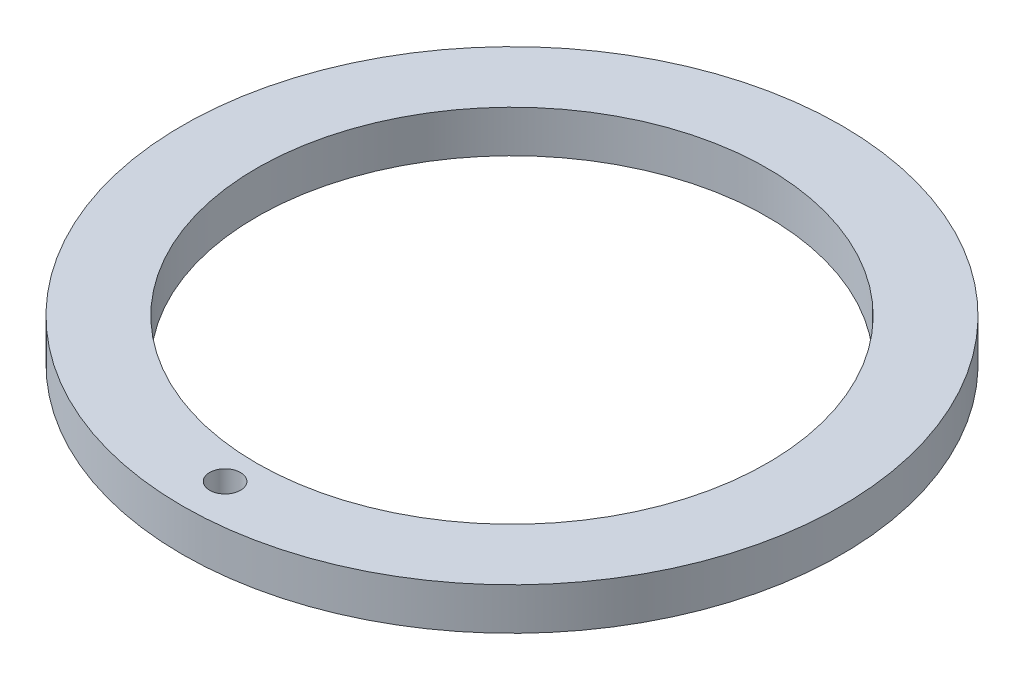
ISO-10303-21;
HEADER;
FILE_DESCRIPTION(('STEP AP214'),'2;1');
FILE_NAME('part.step','',(''),(''),'','','');
FILE_SCHEMA(('AUTOMOTIVE_DESIGN { 1 0 10303 214 1 1 1 1 }'));
ENDSEC;
DATA;
#1=APPLICATION_CONTEXT('core data for automotive mechanical design processes');
#2=APPLICATION_PROTOCOL_DEFINITION('international standard','automotive_design',2000,#1);
#3=PRODUCT_CONTEXT('',#1,'mechanical');
#4=PRODUCT('Part','Part','',(#3));
#5=PRODUCT_RELATED_PRODUCT_CATEGORY('part','',(#4));
#6=PRODUCT_DEFINITION_FORMATION('','',#4);
#7=PRODUCT_DEFINITION_CONTEXT('part definition',#1,'design');
#8=PRODUCT_DEFINITION('design','',#6,#7);
#9=PRODUCT_DEFINITION_SHAPE('','',#8);
#10=(LENGTH_UNIT() NAMED_UNIT(*) SI_UNIT(.MILLI.,.METRE.));
#11=(NAMED_UNIT(*) PLANE_ANGLE_UNIT() SI_UNIT($,.RADIAN.));
#12=(NAMED_UNIT(*) SI_UNIT($,.STERADIAN.) SOLID_ANGLE_UNIT());
#13=UNCERTAINTY_MEASURE_WITH_UNIT(LENGTH_MEASURE(1.E-05),#10,'distance_accuracy_value','');
#14=(GEOMETRIC_REPRESENTATION_CONTEXT(3) GLOBAL_UNCERTAINTY_ASSIGNED_CONTEXT((#13)) GLOBAL_UNIT_ASSIGNED_CONTEXT((#10,
#11,#12)) REPRESENTATION_CONTEXT('',''));
#15=CARTESIAN_POINT('',(0.,0.,0.));
#16=DIRECTION('',(0.,0.,1.));
#17=DIRECTION('',(1.,0.,0.));
#18=AXIS2_PLACEMENT_3D('',#15,#16,#17);
#19=CARTESIAN_POINT('',(0.,6.477,0.));
#20=DIRECTION('',(0.,1.,0.));
#21=DIRECTION('',(0.,0.,1.));
#22=AXIS2_PLACEMENT_3D('',#19,#20,#21);
#23=PLANE('',#22);
#24=CARTESIAN_POINT('',(0.,6.477,44.22775));
#25=DIRECTION('',(0.,1.,0.));
#26=DIRECTION('',(0.,0.,1.));
#27=AXIS2_PLACEMENT_3D('',#24,#25,#26);
#28=CIRCLE('',#27,2.38125);
#29=CARTESIAN_POINT('',(0.,6.477,46.609));
#30=VERTEX_POINT('',#29);
#31=EDGE_CURVE('E62',#30,#30,#28,.T.);
#32=ORIENTED_EDGE('',*,*,#31,.F.);
#33=EDGE_LOOP('',(#32));
#34=FACE_BOUND('',#33,.T.);
#35=CARTESIAN_POINT('',(0.,6.477,0.));
#36=DIRECTION('',(0.,1.,0.));
#37=DIRECTION('',(0.,0.,1.));
#38=AXIS2_PLACEMENT_3D('',#35,#36,#37);
#39=CIRCLE('',#38,50.8);
#40=CARTESIAN_POINT('',(0.,6.477,50.8));
#41=VERTEX_POINT('',#40);
#42=EDGE_CURVE('E11',#41,#41,#39,.T.);
#43=ORIENTED_EDGE('',*,*,#42,.T.);
#44=EDGE_LOOP('',(#43));
#45=FACE_BOUND('',#44,.T.);
#46=CARTESIAN_POINT('',(0.,6.477,0.));
#47=DIRECTION('',(0.,1.,0.));
#48=DIRECTION('',(0.,0.,1.));
#49=AXIS2_PLACEMENT_3D('',#46,#47,#48);
#50=CIRCLE('',#49,39.37);
#51=CARTESIAN_POINT('',(0.,6.477,39.37));
#52=VERTEX_POINT('',#51);
#53=EDGE_CURVE('E56',#52,#52,#50,.T.);
#54=ORIENTED_EDGE('',*,*,#53,.F.);
#55=EDGE_LOOP('',(#54));
#56=FACE_BOUND('',#55,.T.);
#57=ADVANCED_FACE('F43',(#34,#45,#56),#23,.T.);
#58=CARTESIAN_POINT('',(0.,0.,0.));
#59=DIRECTION('',(0.,1.,0.));
#60=DIRECTION('',(0.,0.,1.));
#61=AXIS2_PLACEMENT_3D('',#58,#59,#60);
#62=PLANE('',#61);
#63=CARTESIAN_POINT('',(0.,0.,44.22775));
#64=DIRECTION('',(0.,1.,0.));
#65=DIRECTION('',(0.,0.,1.));
#66=AXIS2_PLACEMENT_3D('',#63,#64,#65);
#67=CIRCLE('',#66,2.38125);
#68=CARTESIAN_POINT('',(0.,0.,46.609));
#69=VERTEX_POINT('',#68);
#70=EDGE_CURVE('E66',#69,#69,#67,.T.);
#71=ORIENTED_EDGE('',*,*,#70,.T.);
#72=EDGE_LOOP('',(#71));
#73=FACE_BOUND('',#72,.T.);
#74=CARTESIAN_POINT('',(0.,0.,0.));
#75=DIRECTION('',(0.,1.,0.));
#76=DIRECTION('',(0.,0.,1.));
#77=AXIS2_PLACEMENT_3D('',#74,#75,#76);
#78=CIRCLE('',#77,50.8);
#79=CARTESIAN_POINT('',(0.,0.,50.8));
#80=VERTEX_POINT('',#79);
#81=EDGE_CURVE('E47',#80,#80,#78,.T.);
#82=ORIENTED_EDGE('',*,*,#81,.F.);
#83=EDGE_LOOP('',(#82));
#84=FACE_BOUND('',#83,.T.);
#85=CARTESIAN_POINT('',(0.,0.,0.));
#86=DIRECTION('',(0.,1.,0.));
#87=DIRECTION('',(0.,0.,1.));
#88=AXIS2_PLACEMENT_3D('',#85,#86,#87);
#89=CIRCLE('',#88,39.37);
#90=CARTESIAN_POINT('',(0.,0.,39.37));
#91=VERTEX_POINT('',#90);
#92=EDGE_CURVE('E58',#91,#91,#89,.T.);
#93=ORIENTED_EDGE('',*,*,#92,.T.);
#94=EDGE_LOOP('',(#93));
#95=FACE_BOUND('',#94,.T.);
#96=ADVANCED_FACE('F78',(#73,#84,#95),#62,.F.);
#97=CARTESIAN_POINT('',(0.,6.477,0.));
#98=DIRECTION('',(0.,-1.,0.));
#99=DIRECTION('',(0.,0.,-1.));
#100=AXIS2_PLACEMENT_3D('',#97,#98,#99);
#101=CYLINDRICAL_SURFACE('',#100,50.8);
#102=ORIENTED_EDGE('',*,*,#42,.F.);
#103=EDGE_LOOP('',(#102));
#104=FACE_BOUND('',#103,.T.);
#105=ORIENTED_EDGE('',*,*,#81,.T.);
#106=EDGE_LOOP('',(#105));
#107=FACE_BOUND('',#106,.T.);
#108=ADVANCED_FACE('F45',(#104,#107),#101,.T.);
#109=CARTESIAN_POINT('',(0.,6.477,0.));
#110=DIRECTION('',(0.,-1.,0.));
#111=DIRECTION('',(0.,0.,-1.));
#112=AXIS2_PLACEMENT_3D('',#109,#110,#111);
#113=CYLINDRICAL_SURFACE('',#112,39.37);
#114=ORIENTED_EDGE('',*,*,#53,.T.);
#115=EDGE_LOOP('',(#114));
#116=FACE_BOUND('',#115,.T.);
#117=ORIENTED_EDGE('',*,*,#92,.F.);
#118=EDGE_LOOP('',(#117));
#119=FACE_BOUND('',#118,.T.);
#120=ADVANCED_FACE('F83',(#116,#119),#113,.F.);
#121=CARTESIAN_POINT('',(0.,6.477,44.22775));
#122=DIRECTION('',(0.,-1.,0.));
#123=DIRECTION('',(0.,0.,-1.));
#124=AXIS2_PLACEMENT_3D('',#121,#122,#123);
#125=CYLINDRICAL_SURFACE('',#124,2.38125);
#126=ORIENTED_EDGE('',*,*,#31,.T.);
#127=EDGE_LOOP('',(#126));
#128=FACE_BOUND('',#127,.T.);
#129=ORIENTED_EDGE('',*,*,#70,.F.);
#130=EDGE_LOOP('',(#129));
#131=FACE_BOUND('',#130,.T.);
#132=ADVANCED_FACE('F74',(#128,#131),#125,.F.);
#133=CLOSED_SHELL('',(#57,#96,#108,#120,#132));
#134=MANIFOLD_SOLID_BREP('B2',#133);
#135=ADVANCED_BREP_SHAPE_REPRESENTATION('',(#18,#134),#14);
#136=SHAPE_DEFINITION_REPRESENTATION(#9,#135);
ENDSEC;
END-ISO-10303-21;
